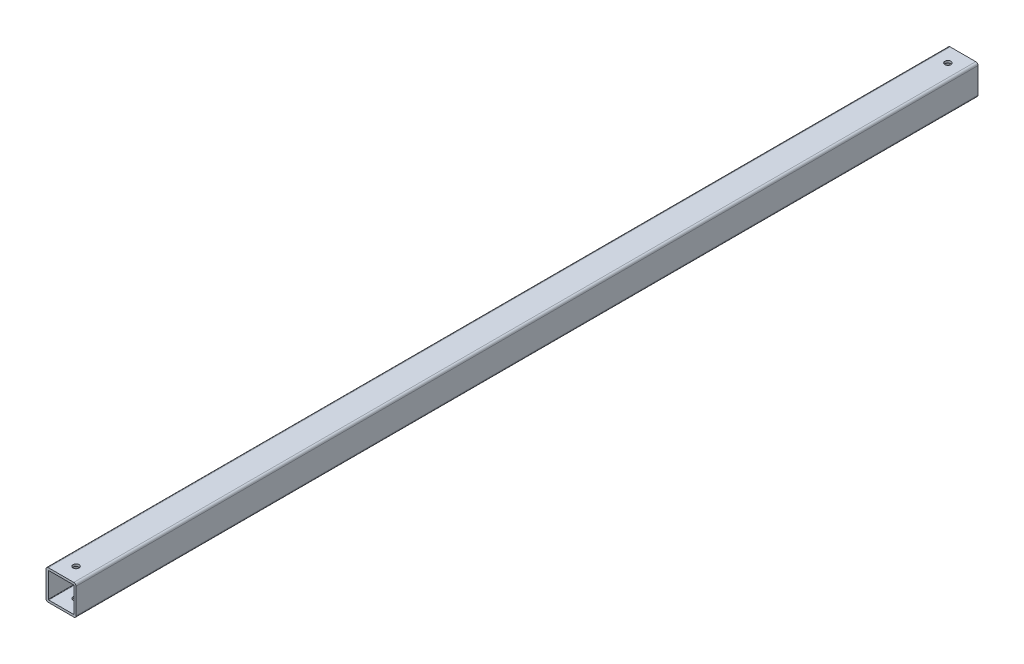
ISO-10303-21;
HEADER;
FILE_DESCRIPTION(('STEP AP214'),'2;1');
FILE_NAME('part.step','',(''),(''),'','','');
FILE_SCHEMA(('AUTOMOTIVE_DESIGN { 1 0 10303 214 1 1 1 1 }'));
ENDSEC;
DATA;
#1=APPLICATION_CONTEXT('core data for automotive mechanical design processes');
#2=APPLICATION_PROTOCOL_DEFINITION('international standard','automotive_design',2000,#1);
#3=PRODUCT_CONTEXT('',#1,'mechanical');
#4=PRODUCT('Part','Part','',(#3));
#5=PRODUCT_RELATED_PRODUCT_CATEGORY('part','',(#4));
#6=PRODUCT_DEFINITION_FORMATION('','',#4);
#7=PRODUCT_DEFINITION_CONTEXT('part definition',#1,'design');
#8=PRODUCT_DEFINITION('design','',#6,#7);
#9=PRODUCT_DEFINITION_SHAPE('','',#8);
#10=(LENGTH_UNIT() NAMED_UNIT(*) SI_UNIT(.MILLI.,.METRE.));
#11=(NAMED_UNIT(*) PLANE_ANGLE_UNIT() SI_UNIT($,.RADIAN.));
#12=(NAMED_UNIT(*) SI_UNIT($,.STERADIAN.) SOLID_ANGLE_UNIT());
#13=UNCERTAINTY_MEASURE_WITH_UNIT(LENGTH_MEASURE(1.E-05),#10,'distance_accuracy_value','');
#14=(GEOMETRIC_REPRESENTATION_CONTEXT(3) GLOBAL_UNCERTAINTY_ASSIGNED_CONTEXT((#13)) GLOBAL_UNIT_ASSIGNED_CONTEXT((#10,
#11,#12)) REPRESENTATION_CONTEXT('',''));
#15=CARTESIAN_POINT('',(0.,0.,0.));
#16=DIRECTION('',(0.,0.,1.));
#17=DIRECTION('',(1.,0.,0.));
#18=AXIS2_PLACEMENT_3D('',#15,#16,#17);
#19=CARTESIAN_POINT('',(0.,0.,1200.));
#20=DIRECTION('',(0.,0.,1.));
#21=DIRECTION('',(1.,0.,0.));
#22=AXIS2_PLACEMENT_3D('',#19,#20,#21);
#23=PLANE('',#22);
#24=DIRECTION('',(1.,0.,0.));
#25=VECTOR('',#24,1.);
#26=CARTESIAN_POINT('',(-20.,-20.,1200.));
#27=LINE('',#26,#25);
#28=CARTESIAN_POINT('',(-17.,-20.,1200.));
#29=VERTEX_POINT('',#28);
#30=CARTESIAN_POINT('',(17.,-20.,1200.));
#31=VERTEX_POINT('',#30);
#32=EDGE_CURVE('E211',#29,#31,#27,.T.);
#33=ORIENTED_EDGE('',*,*,#32,.T.);
#34=CARTESIAN_POINT('',(17.,-17.,1200.));
#35=DIRECTION('',(0.,0.,1.));
#36=DIRECTION('',(1.,0.,0.));
#37=AXIS2_PLACEMENT_3D('',#34,#35,#36);
#38=CIRCLE('',#37,3.);
#39=CARTESIAN_POINT('',(20.,-17.,1200.));
#40=VERTEX_POINT('',#39);
#41=EDGE_CURVE('E270',#31,#40,#38,.T.);
#42=ORIENTED_EDGE('',*,*,#41,.T.);
#43=DIRECTION('',(0.,1.,0.));
#44=VECTOR('',#43,1.);
#45=CARTESIAN_POINT('',(20.,20.,1200.));
#46=LINE('',#45,#44);
#47=CARTESIAN_POINT('',(20.,17.,1200.));
#48=VERTEX_POINT('',#47);
#49=EDGE_CURVE('E311',#40,#48,#46,.T.);
#50=ORIENTED_EDGE('',*,*,#49,.T.);
#51=CARTESIAN_POINT('',(17.,17.,1200.));
#52=DIRECTION('',(0.,0.,1.));
#53=DIRECTION('',(1.,0.,0.));
#54=AXIS2_PLACEMENT_3D('',#51,#52,#53);
#55=CIRCLE('',#54,3.);
#56=CARTESIAN_POINT('',(17.,20.,1200.));
#57=VERTEX_POINT('',#56);
#58=EDGE_CURVE('E266',#48,#57,#55,.T.);
#59=ORIENTED_EDGE('',*,*,#58,.T.);
#60=DIRECTION('',(-1.,0.,0.));
#61=VECTOR('',#60,1.);
#62=CARTESIAN_POINT('',(-20.,20.,1200.));
#63=LINE('',#62,#61);
#64=CARTESIAN_POINT('',(-17.,20.,1200.));
#65=VERTEX_POINT('',#64);
#66=EDGE_CURVE('E314',#57,#65,#63,.T.);
#67=ORIENTED_EDGE('',*,*,#66,.T.);
#68=CARTESIAN_POINT('',(-17.,17.,1200.));
#69=DIRECTION('',(0.,0.,1.));
#70=DIRECTION('',(1.,0.,0.));
#71=AXIS2_PLACEMENT_3D('',#68,#69,#70);
#72=CIRCLE('',#71,3.);
#73=CARTESIAN_POINT('',(-20.,17.,1200.));
#74=VERTEX_POINT('',#73);
#75=EDGE_CURVE('E92',#65,#74,#72,.T.);
#76=ORIENTED_EDGE('',*,*,#75,.T.);
#77=DIRECTION('',(0.,-1.,0.));
#78=VECTOR('',#77,1.);
#79=CARTESIAN_POINT('',(-20.,20.,1200.));
#80=LINE('',#79,#78);
#81=CARTESIAN_POINT('',(-20.,-17.,1200.));
#82=VERTEX_POINT('',#81);
#83=EDGE_CURVE('E216',#74,#82,#80,.T.);
#84=ORIENTED_EDGE('',*,*,#83,.T.);
#85=CARTESIAN_POINT('',(-17.,-17.,1200.));
#86=DIRECTION('',(0.,0.,1.));
#87=DIRECTION('',(1.,0.,0.));
#88=AXIS2_PLACEMENT_3D('',#85,#86,#87);
#89=CIRCLE('',#88,3.);
#90=EDGE_CURVE('E268',#82,#29,#89,.T.);
#91=ORIENTED_EDGE('',*,*,#90,.T.);
#92=EDGE_LOOP('',(#33,#42,#50,#59,#67,#76,#84,#91));
#93=FACE_BOUND('',#92,.T.);
#94=DIRECTION('',(-1.,0.,0.));
#95=VECTOR('',#94,1.);
#96=CARTESIAN_POINT('',(-20.,17.,1200.));
#97=LINE('',#96,#95);
#98=CARTESIAN_POINT('',(16.5,17.,1200.));
#99=VERTEX_POINT('',#98);
#100=CARTESIAN_POINT('',(-16.5,17.,1200.));
#101=VERTEX_POINT('',#100);
#102=EDGE_CURVE('E298',#99,#101,#97,.T.);
#103=ORIENTED_EDGE('',*,*,#102,.F.);
#104=CARTESIAN_POINT('',(16.5,16.5,1200.));
#105=DIRECTION('',(0.,0.,1.));
#106=DIRECTION('',(1.,0.,0.));
#107=AXIS2_PLACEMENT_3D('',#104,#105,#106);
#108=CIRCLE('',#107,0.5);
#109=CARTESIAN_POINT('',(17.,16.5,1200.));
#110=VERTEX_POINT('',#109);
#111=EDGE_CURVE('E241',#99,#110,#108,.F.);
#112=ORIENTED_EDGE('',*,*,#111,.T.);
#113=DIRECTION('',(0.,1.,0.));
#114=VECTOR('',#113,1.);
#115=CARTESIAN_POINT('',(17.,20.,1200.));
#116=LINE('',#115,#114);
#117=CARTESIAN_POINT('',(17.,-16.5,1200.));
#118=VERTEX_POINT('',#117);
#119=EDGE_CURVE('E295',#118,#110,#116,.T.);
#120=ORIENTED_EDGE('',*,*,#119,.F.);
#121=CARTESIAN_POINT('',(16.5,-16.5,1200.));
#122=DIRECTION('',(0.,0.,1.));
#123=DIRECTION('',(1.,0.,0.));
#124=AXIS2_PLACEMENT_3D('',#121,#122,#123);
#125=CIRCLE('',#124,0.5);
#126=CARTESIAN_POINT('',(16.5,-17.,1200.));
#127=VERTEX_POINT('',#126);
#128=EDGE_CURVE('E245',#118,#127,#125,.F.);
#129=ORIENTED_EDGE('',*,*,#128,.T.);
#130=DIRECTION('',(1.,0.,0.));
#131=VECTOR('',#130,1.);
#132=CARTESIAN_POINT('',(-20.,-17.,1200.));
#133=LINE('',#132,#131);
#134=CARTESIAN_POINT('',(-16.5,-17.,1200.));
#135=VERTEX_POINT('',#134);
#136=EDGE_CURVE('E303',#135,#127,#133,.T.);
#137=ORIENTED_EDGE('',*,*,#136,.F.);
#138=CARTESIAN_POINT('',(-16.5,-16.5,1200.));
#139=DIRECTION('',(0.,0.,1.));
#140=DIRECTION('',(1.,0.,0.));
#141=AXIS2_PLACEMENT_3D('',#138,#139,#140);
#142=CIRCLE('',#141,0.5);
#143=CARTESIAN_POINT('',(-17.,-16.5,1200.));
#144=VERTEX_POINT('',#143);
#145=EDGE_CURVE('E197',#135,#144,#142,.F.);
#146=ORIENTED_EDGE('',*,*,#145,.T.);
#147=DIRECTION('',(0.,-1.,0.));
#148=VECTOR('',#147,1.);
#149=CARTESIAN_POINT('',(-17.,20.,1200.));
#150=LINE('',#149,#148);
#151=CARTESIAN_POINT('',(-17.,16.5,1200.));
#152=VERTEX_POINT('',#151);
#153=EDGE_CURVE('E301',#152,#144,#150,.T.);
#154=ORIENTED_EDGE('',*,*,#153,.F.);
#155=CARTESIAN_POINT('',(-16.5,16.5,1200.));
#156=DIRECTION('',(0.,0.,1.));
#157=DIRECTION('',(1.,0.,0.));
#158=AXIS2_PLACEMENT_3D('',#155,#156,#157);
#159=CIRCLE('',#158,0.5);
#160=EDGE_CURVE('E196',#152,#101,#159,.F.);
#161=ORIENTED_EDGE('',*,*,#160,.T.);
#162=EDGE_LOOP('',(#103,#112,#120,#129,#137,#146,#154,#161));
#163=FACE_BOUND('',#162,.T.);
#164=ADVANCED_FACE('F68',(#93,#163),#23,.T.);
#165=CARTESIAN_POINT('',(0.,0.,0.));
#166=DIRECTION('',(0.,0.,1.));
#167=DIRECTION('',(1.,0.,0.));
#168=AXIS2_PLACEMENT_3D('',#165,#166,#167);
#169=PLANE('',#168);
#170=DIRECTION('',(0.,1.,0.));
#171=VECTOR('',#170,1.);
#172=CARTESIAN_POINT('',(20.,20.,0.));
#173=LINE('',#172,#171);
#174=CARTESIAN_POINT('',(20.,-17.,0.));
#175=VERTEX_POINT('',#174);
#176=CARTESIAN_POINT('',(20.,17.,0.));
#177=VERTEX_POINT('',#176);
#178=EDGE_CURVE('E306',#175,#177,#173,.T.);
#179=ORIENTED_EDGE('',*,*,#178,.F.);
#180=CARTESIAN_POINT('',(17.,-17.,0.));
#181=DIRECTION('',(0.,0.,1.));
#182=DIRECTION('',(1.,0.,0.));
#183=AXIS2_PLACEMENT_3D('',#180,#181,#182);
#184=CIRCLE('',#183,3.);
#185=CARTESIAN_POINT('',(17.,-20.,0.));
#186=VERTEX_POINT('',#185);
#187=EDGE_CURVE('E258',#175,#186,#184,.F.);
#188=ORIENTED_EDGE('',*,*,#187,.T.);
#189=DIRECTION('',(1.,0.,0.));
#190=VECTOR('',#189,1.);
#191=CARTESIAN_POINT('',(-20.,-20.,0.));
#192=LINE('',#191,#190);
#193=CARTESIAN_POINT('',(-17.,-20.,0.));
#194=VERTEX_POINT('',#193);
#195=EDGE_CURVE('E219',#194,#186,#192,.T.);
#196=ORIENTED_EDGE('',*,*,#195,.F.);
#197=CARTESIAN_POINT('',(-17.,-17.,0.));
#198=DIRECTION('',(0.,0.,1.));
#199=DIRECTION('',(1.,0.,0.));
#200=AXIS2_PLACEMENT_3D('',#197,#198,#199);
#201=CIRCLE('',#200,3.);
#202=CARTESIAN_POINT('',(-20.,-17.,0.));
#203=VERTEX_POINT('',#202);
#204=EDGE_CURVE('E256',#194,#203,#201,.F.);
#205=ORIENTED_EDGE('',*,*,#204,.T.);
#206=DIRECTION('',(0.,-1.,0.));
#207=VECTOR('',#206,1.);
#208=CARTESIAN_POINT('',(-20.,20.,0.));
#209=LINE('',#208,#207);
#210=CARTESIAN_POINT('',(-20.,17.,0.));
#211=VERTEX_POINT('',#210);
#212=EDGE_CURVE('E321',#211,#203,#209,.T.);
#213=ORIENTED_EDGE('',*,*,#212,.F.);
#214=CARTESIAN_POINT('',(-17.,17.,0.));
#215=DIRECTION('',(0.,0.,1.));
#216=DIRECTION('',(1.,0.,0.));
#217=AXIS2_PLACEMENT_3D('',#214,#215,#216);
#218=CIRCLE('',#217,3.);
#219=CARTESIAN_POINT('',(-17.,20.,0.));
#220=VERTEX_POINT('',#219);
#221=EDGE_CURVE('E252',#211,#220,#218,.F.);
#222=ORIENTED_EDGE('',*,*,#221,.T.);
#223=DIRECTION('',(-1.,0.,0.));
#224=VECTOR('',#223,1.);
#225=CARTESIAN_POINT('',(-20.,20.,0.));
#226=LINE('',#225,#224);
#227=CARTESIAN_POINT('',(17.,20.,0.));
#228=VERTEX_POINT('',#227);
#229=EDGE_CURVE('E319',#228,#220,#226,.T.);
#230=ORIENTED_EDGE('',*,*,#229,.F.);
#231=CARTESIAN_POINT('',(17.,17.,0.));
#232=DIRECTION('',(0.,0.,1.));
#233=DIRECTION('',(1.,0.,0.));
#234=AXIS2_PLACEMENT_3D('',#231,#232,#233);
#235=CIRCLE('',#234,3.);
#236=EDGE_CURVE('E254',#228,#177,#235,.F.);
#237=ORIENTED_EDGE('',*,*,#236,.T.);
#238=EDGE_LOOP('',(#179,#188,#196,#205,#213,#222,#230,#237));
#239=FACE_BOUND('',#238,.T.);
#240=DIRECTION('',(1.,0.,0.));
#241=VECTOR('',#240,1.);
#242=CARTESIAN_POINT('',(-20.,-17.,0.));
#243=LINE('',#242,#241);
#244=CARTESIAN_POINT('',(-16.5,-17.,0.));
#245=VERTEX_POINT('',#244);
#246=CARTESIAN_POINT('',(16.5,-17.,0.));
#247=VERTEX_POINT('',#246);
#248=EDGE_CURVE('E207',#245,#247,#243,.T.);
#249=ORIENTED_EDGE('',*,*,#248,.T.);
#250=CARTESIAN_POINT('',(16.5,-16.5,0.));
#251=DIRECTION('',(0.,0.,1.));
#252=DIRECTION('',(1.,0.,0.));
#253=AXIS2_PLACEMENT_3D('',#250,#251,#252);
#254=CIRCLE('',#253,0.5);
#255=CARTESIAN_POINT('',(17.,-16.5,0.));
#256=VERTEX_POINT('',#255);
#257=EDGE_CURVE('E243',#247,#256,#254,.T.);
#258=ORIENTED_EDGE('',*,*,#257,.T.);
#259=DIRECTION('',(0.,1.,0.));
#260=VECTOR('',#259,1.);
#261=CARTESIAN_POINT('',(17.,20.,0.));
#262=LINE('',#261,#260);
#263=CARTESIAN_POINT('',(17.,16.5,0.));
#264=VERTEX_POINT('',#263);
#265=EDGE_CURVE('E283',#256,#264,#262,.T.);
#266=ORIENTED_EDGE('',*,*,#265,.T.);
#267=CARTESIAN_POINT('',(16.5,16.5,0.));
#268=DIRECTION('',(0.,0.,1.));
#269=DIRECTION('',(1.,0.,0.));
#270=AXIS2_PLACEMENT_3D('',#267,#268,#269);
#271=CIRCLE('',#270,0.5);
#272=CARTESIAN_POINT('',(16.5,17.,0.));
#273=VERTEX_POINT('',#272);
#274=EDGE_CURVE('E239',#264,#273,#271,.T.);
#275=ORIENTED_EDGE('',*,*,#274,.T.);
#276=DIRECTION('',(-1.,0.,0.));
#277=VECTOR('',#276,1.);
#278=CARTESIAN_POINT('',(-20.,17.,0.));
#279=LINE('',#278,#277);
#280=CARTESIAN_POINT('',(-16.5,17.,0.));
#281=VERTEX_POINT('',#280);
#282=EDGE_CURVE('E191',#273,#281,#279,.T.);
#283=ORIENTED_EDGE('',*,*,#282,.T.);
#284=CARTESIAN_POINT('',(-16.5,16.5,0.));
#285=DIRECTION('',(0.,0.,1.));
#286=DIRECTION('',(1.,0.,0.));
#287=AXIS2_PLACEMENT_3D('',#284,#285,#286);
#288=CIRCLE('',#287,0.5);
#289=CARTESIAN_POINT('',(-17.,16.5,0.));
#290=VERTEX_POINT('',#289);
#291=EDGE_CURVE('E185',#281,#290,#288,.T.);
#292=ORIENTED_EDGE('',*,*,#291,.T.);
#293=DIRECTION('',(0.,-1.,0.));
#294=VECTOR('',#293,1.);
#295=CARTESIAN_POINT('',(-17.,20.,0.));
#296=LINE('',#295,#294);
#297=CARTESIAN_POINT('',(-17.,-16.5,0.));
#298=VERTEX_POINT('',#297);
#299=EDGE_CURVE('E189',#290,#298,#296,.T.);
#300=ORIENTED_EDGE('',*,*,#299,.T.);
#301=CARTESIAN_POINT('',(-16.5,-16.5,0.));
#302=DIRECTION('',(0.,0.,1.));
#303=DIRECTION('',(1.,0.,0.));
#304=AXIS2_PLACEMENT_3D('',#301,#302,#303);
#305=CIRCLE('',#304,0.5);
#306=EDGE_CURVE('E235',#298,#245,#305,.T.);
#307=ORIENTED_EDGE('',*,*,#306,.T.);
#308=EDGE_LOOP('',(#249,#258,#266,#275,#283,#292,#300,#307));
#309=FACE_BOUND('',#308,.T.);
#310=ADVANCED_FACE('F188',(#239,#309),#169,.F.);
#311=CARTESIAN_POINT('',(20.,20.,1200.));
#312=DIRECTION('',(-1.,0.,0.));
#313=DIRECTION('',(0.,-1.,0.));
#314=AXIS2_PLACEMENT_3D('',#311,#312,#313);
#315=PLANE('',#314);
#316=ORIENTED_EDGE('',*,*,#49,.F.);
#317=DIRECTION('',(0.,0.,-1.));
#318=VECTOR('',#317,1.);
#319=CARTESIAN_POINT('',(20.,-17.,1200.));
#320=LINE('',#319,#318);
#321=EDGE_CURVE('E249',#40,#175,#320,.T.);
#322=ORIENTED_EDGE('',*,*,#321,.T.);
#323=ORIENTED_EDGE('',*,*,#178,.T.);
#324=DIRECTION('',(0.,0.,-1.));
#325=VECTOR('',#324,1.);
#326=CARTESIAN_POINT('',(20.,17.,1200.));
#327=LINE('',#326,#325);
#328=EDGE_CURVE('E247',#177,#48,#327,.F.);
#329=ORIENTED_EDGE('',*,*,#328,.T.);
#330=EDGE_LOOP('',(#316,#322,#323,#329));
#331=FACE_BOUND('',#330,.T.);
#332=ADVANCED_FACE('F339',(#331),#315,.F.);
#333=CARTESIAN_POINT('',(-20.,20.,1200.));
#334=DIRECTION('',(0.,-1.,0.));
#335=DIRECTION('',(0.,0.,-1.));
#336=AXIS2_PLACEMENT_3D('',#333,#334,#335);
#337=PLANE('',#336);
#338=CARTESIAN_POINT('',(0.,20.,20.));
#339=DIRECTION('',(0.,1.,0.));
#340=DIRECTION('',(0.,0.,1.));
#341=AXIS2_PLACEMENT_3D('',#338,#339,#340);
#342=CIRCLE('',#341,4.);
#343=CARTESIAN_POINT('',(0.,20.,24.));
#344=VERTEX_POINT('',#343);
#345=EDGE_CURVE('E449',#344,#344,#342,.T.);
#346=ORIENTED_EDGE('',*,*,#345,.F.);
#347=EDGE_LOOP('',(#346));
#348=FACE_BOUND('',#347,.T.);
#349=CARTESIAN_POINT('',(1.44508322299388E-13,20.,1180.));
#350=DIRECTION('',(0.,1.,0.));
#351=DIRECTION('',(0.,0.,1.));
#352=AXIS2_PLACEMENT_3D('',#349,#350,#351);
#353=CIRCLE('',#352,4.);
#354=CARTESIAN_POINT('',(1.44508322299388E-13,20.,1184.));
#355=VERTEX_POINT('',#354);
#356=EDGE_CURVE('E286',#355,#355,#353,.T.);
#357=ORIENTED_EDGE('',*,*,#356,.F.);
#358=EDGE_LOOP('',(#357));
#359=FACE_BOUND('',#358,.T.);
#360=ORIENTED_EDGE('',*,*,#66,.F.);
#361=DIRECTION('',(0.,0.,-1.));
#362=VECTOR('',#361,1.);
#363=CARTESIAN_POINT('',(17.,20.,1200.));
#364=LINE('',#363,#362);
#365=EDGE_CURVE('E14',#57,#228,#364,.T.);
#366=ORIENTED_EDGE('',*,*,#365,.T.);
#367=ORIENTED_EDGE('',*,*,#229,.T.);
#368=DIRECTION('',(0.,0.,-1.));
#369=VECTOR('',#368,1.);
#370=CARTESIAN_POINT('',(-17.,20.,1200.));
#371=LINE('',#370,#369);
#372=EDGE_CURVE('E77',#220,#65,#371,.F.);
#373=ORIENTED_EDGE('',*,*,#372,.T.);
#374=EDGE_LOOP('',(#360,#366,#367,#373));
#375=FACE_BOUND('',#374,.T.);
#376=ADVANCED_FACE('F347',(#348,#359,#375),#337,.F.);
#377=CARTESIAN_POINT('',(-20.,20.,1200.));
#378=DIRECTION('',(1.,0.,0.));
#379=DIRECTION('',(0.,1.,0.));
#380=AXIS2_PLACEMENT_3D('',#377,#378,#379);
#381=PLANE('',#380);
#382=ORIENTED_EDGE('',*,*,#212,.T.);
#383=DIRECTION('',(0.,0.,-1.));
#384=VECTOR('',#383,1.);
#385=CARTESIAN_POINT('',(-20.,-17.,1200.));
#386=LINE('',#385,#384);
#387=EDGE_CURVE('E85',#203,#82,#386,.F.);
#388=ORIENTED_EDGE('',*,*,#387,.T.);
#389=ORIENTED_EDGE('',*,*,#83,.F.);
#390=DIRECTION('',(0.,0.,-1.));
#391=VECTOR('',#390,1.);
#392=CARTESIAN_POINT('',(-20.,17.,1200.));
#393=LINE('',#392,#391);
#394=EDGE_CURVE('E272',#74,#211,#393,.T.);
#395=ORIENTED_EDGE('',*,*,#394,.T.);
#396=EDGE_LOOP('',(#382,#388,#389,#395));
#397=FACE_BOUND('',#396,.T.);
#398=ADVANCED_FACE('F352',(#397),#381,.F.);
#399=CARTESIAN_POINT('',(-20.,-20.,1200.));
#400=DIRECTION('',(0.,1.,0.));
#401=DIRECTION('',(0.,0.,1.));
#402=AXIS2_PLACEMENT_3D('',#399,#400,#401);
#403=PLANE('',#402);
#404=CARTESIAN_POINT('',(0.,-20.,20.));
#405=DIRECTION('',(0.,1.,0.));
#406=DIRECTION('',(0.,0.,1.));
#407=AXIS2_PLACEMENT_3D('',#404,#405,#406);
#408=CIRCLE('',#407,3.99999999999999);
#409=CARTESIAN_POINT('',(0.,-20.,24.));
#410=VERTEX_POINT('',#409);
#411=EDGE_CURVE('E450',#410,#410,#408,.T.);
#412=ORIENTED_EDGE('',*,*,#411,.T.);
#413=EDGE_LOOP('',(#412));
#414=FACE_BOUND('',#413,.T.);
#415=CARTESIAN_POINT('',(1.44508322299388E-13,-20.,1180.));
#416=DIRECTION('',(0.,1.,0.));
#417=DIRECTION('',(0.,0.,1.));
#418=AXIS2_PLACEMENT_3D('',#415,#416,#417);
#419=CIRCLE('',#418,3.99999999999999);
#420=CARTESIAN_POINT('',(1.44508322299388E-13,-20.,1184.));
#421=VERTEX_POINT('',#420);
#422=EDGE_CURVE('E279',#421,#421,#419,.T.);
#423=ORIENTED_EDGE('',*,*,#422,.T.);
#424=EDGE_LOOP('',(#423));
#425=FACE_BOUND('',#424,.T.);
#426=ORIENTED_EDGE('',*,*,#195,.T.);
#427=DIRECTION('',(0.,0.,-1.));
#428=VECTOR('',#427,1.);
#429=CARTESIAN_POINT('',(17.,-20.,1200.));
#430=LINE('',#429,#428);
#431=EDGE_CURVE('E263',#186,#31,#430,.F.);
#432=ORIENTED_EDGE('',*,*,#431,.T.);
#433=ORIENTED_EDGE('',*,*,#32,.F.);
#434=DIRECTION('',(0.,0.,-1.));
#435=VECTOR('',#434,1.);
#436=CARTESIAN_POINT('',(-17.,-20.,1200.));
#437=LINE('',#436,#435);
#438=EDGE_CURVE('E260',#29,#194,#437,.T.);
#439=ORIENTED_EDGE('',*,*,#438,.T.);
#440=EDGE_LOOP('',(#426,#432,#433,#439));
#441=FACE_BOUND('',#440,.T.);
#442=ADVANCED_FACE('F327',(#414,#425,#441),#403,.F.);
#443=CARTESIAN_POINT('',(17.,20.,1200.));
#444=DIRECTION('',(-1.,0.,0.));
#445=DIRECTION('',(0.,-1.,0.));
#446=AXIS2_PLACEMENT_3D('',#443,#444,#445);
#447=PLANE('',#446);
#448=ORIENTED_EDGE('',*,*,#119,.T.);
#449=DIRECTION('',(0.,0.,-1.));
#450=VECTOR('',#449,1.);
#451=CARTESIAN_POINT('',(17.,16.5,0.));
#452=LINE('',#451,#450);
#453=EDGE_CURVE('E232',#110,#264,#452,.T.);
#454=ORIENTED_EDGE('',*,*,#453,.T.);
#455=ORIENTED_EDGE('',*,*,#265,.F.);
#456=DIRECTION('',(0.,0.,-1.));
#457=VECTOR('',#456,1.);
#458=CARTESIAN_POINT('',(17.,-16.5,1200.));
#459=LINE('',#458,#457);
#460=EDGE_CURVE('E230',#256,#118,#459,.F.);
#461=ORIENTED_EDGE('',*,*,#460,.T.);
#462=EDGE_LOOP('',(#448,#454,#455,#461));
#463=FACE_BOUND('',#462,.T.);
#464=ADVANCED_FACE('F371',(#463),#447,.T.);
#465=CARTESIAN_POINT('',(-20.,17.,1200.));
#466=DIRECTION('',(0.,-1.,0.));
#467=DIRECTION('',(0.,0.,-1.));
#468=AXIS2_PLACEMENT_3D('',#465,#466,#467);
#469=PLANE('',#468);
#470=CARTESIAN_POINT('',(0.,17.,20.));
#471=DIRECTION('',(0.,-1.,0.));
#472=DIRECTION('',(0.,0.,-1.));
#473=AXIS2_PLACEMENT_3D('',#470,#471,#472);
#474=CIRCLE('',#473,4.);
#475=CARTESIAN_POINT('',(0.,17.,16.));
#476=VERTEX_POINT('',#475);
#477=EDGE_CURVE('E72',#476,#476,#474,.T.);
#478=ORIENTED_EDGE('',*,*,#477,.F.);
#479=EDGE_LOOP('',(#478));
#480=FACE_BOUND('',#479,.T.);
#481=CARTESIAN_POINT('',(1.44508322299388E-13,17.,1180.));
#482=DIRECTION('',(0.,-1.,0.));
#483=DIRECTION('',(0.,0.,-1.));
#484=AXIS2_PLACEMENT_3D('',#481,#482,#483);
#485=CIRCLE('',#484,4.);
#486=CARTESIAN_POINT('',(1.44508322299388E-13,17.,1176.));
#487=VERTEX_POINT('',#486);
#488=EDGE_CURVE('E278',#487,#487,#485,.T.);
#489=ORIENTED_EDGE('',*,*,#488,.F.);
#490=EDGE_LOOP('',(#489));
#491=FACE_BOUND('',#490,.T.);
#492=ORIENTED_EDGE('',*,*,#102,.T.);
#493=DIRECTION('',(0.,0.,-1.));
#494=VECTOR('',#493,1.);
#495=CARTESIAN_POINT('',(-16.5,17.,0.));
#496=LINE('',#495,#494);
#497=EDGE_CURVE('E228',#101,#281,#496,.T.);
#498=ORIENTED_EDGE('',*,*,#497,.T.);
#499=ORIENTED_EDGE('',*,*,#282,.F.);
#500=DIRECTION('',(0.,0.,-1.));
#501=VECTOR('',#500,1.);
#502=CARTESIAN_POINT('',(16.5,17.,1200.));
#503=LINE('',#502,#501);
#504=EDGE_CURVE('E226',#273,#99,#503,.F.);
#505=ORIENTED_EDGE('',*,*,#504,.T.);
#506=EDGE_LOOP('',(#492,#498,#499,#505));
#507=FACE_BOUND('',#506,.T.);
#508=ADVANCED_FACE('F411',(#480,#491,#507),#469,.T.);
#509=CARTESIAN_POINT('',(-17.,20.,1200.));
#510=DIRECTION('',(1.,0.,0.));
#511=DIRECTION('',(0.,1.,0.));
#512=AXIS2_PLACEMENT_3D('',#509,#510,#511);
#513=PLANE('',#512);
#514=ORIENTED_EDGE('',*,*,#153,.T.);
#515=DIRECTION('',(0.,0.,-1.));
#516=VECTOR('',#515,1.);
#517=CARTESIAN_POINT('',(-17.,-16.5,0.));
#518=LINE('',#517,#516);
#519=EDGE_CURVE('E206',#144,#298,#518,.T.);
#520=ORIENTED_EDGE('',*,*,#519,.T.);
#521=ORIENTED_EDGE('',*,*,#299,.F.);
#522=DIRECTION('',(0.,0.,-1.));
#523=VECTOR('',#522,1.);
#524=CARTESIAN_POINT('',(-17.,16.5,1200.));
#525=LINE('',#524,#523);
#526=EDGE_CURVE('E203',#290,#152,#525,.F.);
#527=ORIENTED_EDGE('',*,*,#526,.T.);
#528=EDGE_LOOP('',(#514,#520,#521,#527));
#529=FACE_BOUND('',#528,.T.);
#530=ADVANCED_FACE('F202',(#529),#513,.T.);
#531=CARTESIAN_POINT('',(-20.,-17.,1200.));
#532=DIRECTION('',(0.,1.,0.));
#533=DIRECTION('',(0.,0.,1.));
#534=AXIS2_PLACEMENT_3D('',#531,#532,#533);
#535=PLANE('',#534);
#536=CARTESIAN_POINT('',(0.,-17.,20.));
#537=DIRECTION('',(0.,1.,0.));
#538=DIRECTION('',(0.,0.,1.));
#539=AXIS2_PLACEMENT_3D('',#536,#537,#538);
#540=CIRCLE('',#539,4.);
#541=CARTESIAN_POINT('',(0.,-17.,24.));
#542=VERTEX_POINT('',#541);
#543=EDGE_CURVE('E291',#542,#542,#540,.T.);
#544=ORIENTED_EDGE('',*,*,#543,.F.);
#545=EDGE_LOOP('',(#544));
#546=FACE_BOUND('',#545,.T.);
#547=CARTESIAN_POINT('',(1.44508322299388E-13,-17.,1180.));
#548=DIRECTION('',(0.,1.,0.));
#549=DIRECTION('',(0.,0.,1.));
#550=AXIS2_PLACEMENT_3D('',#547,#548,#549);
#551=CIRCLE('',#550,4.);
#552=CARTESIAN_POINT('',(1.44508322299388E-13,-17.,1184.));
#553=VERTEX_POINT('',#552);
#554=EDGE_CURVE('E276',#553,#553,#551,.T.);
#555=ORIENTED_EDGE('',*,*,#554,.F.);
#556=EDGE_LOOP('',(#555));
#557=FACE_BOUND('',#556,.T.);
#558=ORIENTED_EDGE('',*,*,#248,.F.);
#559=DIRECTION('',(0.,0.,-1.));
#560=VECTOR('',#559,1.);
#561=CARTESIAN_POINT('',(-16.5,-17.,1200.));
#562=LINE('',#561,#560);
#563=EDGE_CURVE('E224',#245,#135,#562,.F.);
#564=ORIENTED_EDGE('',*,*,#563,.T.);
#565=ORIENTED_EDGE('',*,*,#136,.T.);
#566=DIRECTION('',(0.,0.,-1.));
#567=VECTOR('',#566,1.);
#568=CARTESIAN_POINT('',(16.5,-17.,0.));
#569=LINE('',#568,#567);
#570=EDGE_CURVE('E213',#127,#247,#569,.T.);
#571=ORIENTED_EDGE('',*,*,#570,.T.);
#572=EDGE_LOOP('',(#558,#564,#565,#571));
#573=FACE_BOUND('',#572,.T.);
#574=ADVANCED_FACE('F387',(#546,#557,#573),#535,.T.);
#575=CARTESIAN_POINT('',(-16.5,-16.5,1200.));
#576=DIRECTION('',(0.,0.,1.));
#577=DIRECTION('',(1.,0.,0.));
#578=AXIS2_PLACEMENT_3D('',#575,#576,#577);
#579=CYLINDRICAL_SURFACE('',#578,0.5);
#580=ORIENTED_EDGE('',*,*,#145,.F.);
#581=ORIENTED_EDGE('',*,*,#563,.F.);
#582=ORIENTED_EDGE('',*,*,#306,.F.);
#583=ORIENTED_EDGE('',*,*,#519,.F.);
#584=EDGE_LOOP('',(#580,#581,#582,#583));
#585=FACE_BOUND('',#584,.T.);
#586=ADVANCED_FACE('F384',(#585),#579,.F.);
#587=CARTESIAN_POINT('',(-16.5,16.5,1200.));
#588=DIRECTION('',(0.,0.,1.));
#589=DIRECTION('',(1.,0.,0.));
#590=AXIS2_PLACEMENT_3D('',#587,#588,#589);
#591=CYLINDRICAL_SURFACE('',#590,0.5);
#592=ORIENTED_EDGE('',*,*,#160,.F.);
#593=ORIENTED_EDGE('',*,*,#526,.F.);
#594=ORIENTED_EDGE('',*,*,#291,.F.);
#595=ORIENTED_EDGE('',*,*,#497,.F.);
#596=EDGE_LOOP('',(#592,#593,#594,#595));
#597=FACE_BOUND('',#596,.T.);
#598=ADVANCED_FACE('F210',(#597),#591,.F.);
#599=CARTESIAN_POINT('',(16.5,16.5,1200.));
#600=DIRECTION('',(0.,0.,1.));
#601=DIRECTION('',(1.,0.,0.));
#602=AXIS2_PLACEMENT_3D('',#599,#600,#601);
#603=CYLINDRICAL_SURFACE('',#602,0.5);
#604=ORIENTED_EDGE('',*,*,#111,.F.);
#605=ORIENTED_EDGE('',*,*,#504,.F.);
#606=ORIENTED_EDGE('',*,*,#274,.F.);
#607=ORIENTED_EDGE('',*,*,#453,.F.);
#608=EDGE_LOOP('',(#604,#605,#606,#607));
#609=FACE_BOUND('',#608,.T.);
#610=ADVANCED_FACE('F391',(#609),#603,.F.);
#611=CARTESIAN_POINT('',(16.5,-16.5,1200.));
#612=DIRECTION('',(0.,0.,1.));
#613=DIRECTION('',(1.,0.,0.));
#614=AXIS2_PLACEMENT_3D('',#611,#612,#613);
#615=CYLINDRICAL_SURFACE('',#614,0.5);
#616=ORIENTED_EDGE('',*,*,#128,.F.);
#617=ORIENTED_EDGE('',*,*,#460,.F.);
#618=ORIENTED_EDGE('',*,*,#257,.F.);
#619=ORIENTED_EDGE('',*,*,#570,.F.);
#620=EDGE_LOOP('',(#616,#617,#618,#619));
#621=FACE_BOUND('',#620,.T.);
#622=ADVANCED_FACE('F362',(#621),#615,.F.);
#623=CARTESIAN_POINT('',(17.,-17.,1200.));
#624=DIRECTION('',(0.,0.,-1.));
#625=DIRECTION('',(-1.,0.,0.));
#626=AXIS2_PLACEMENT_3D('',#623,#624,#625);
#627=CYLINDRICAL_SURFACE('',#626,3.);
#628=ORIENTED_EDGE('',*,*,#41,.F.);
#629=ORIENTED_EDGE('',*,*,#431,.F.);
#630=ORIENTED_EDGE('',*,*,#187,.F.);
#631=ORIENTED_EDGE('',*,*,#321,.F.);
#632=EDGE_LOOP('',(#628,#629,#630,#631));
#633=FACE_BOUND('',#632,.T.);
#634=ADVANCED_FACE('F333',(#633),#627,.T.);
#635=CARTESIAN_POINT('',(-17.,-17.,1200.));
#636=DIRECTION('',(0.,0.,-1.));
#637=DIRECTION('',(-1.,0.,0.));
#638=AXIS2_PLACEMENT_3D('',#635,#636,#637);
#639=CYLINDRICAL_SURFACE('',#638,3.);
#640=ORIENTED_EDGE('',*,*,#90,.F.);
#641=ORIENTED_EDGE('',*,*,#387,.F.);
#642=ORIENTED_EDGE('',*,*,#204,.F.);
#643=ORIENTED_EDGE('',*,*,#438,.F.);
#644=EDGE_LOOP('',(#640,#641,#642,#643));
#645=FACE_BOUND('',#644,.T.);
#646=ADVANCED_FACE('F355',(#645),#639,.T.);
#647=CARTESIAN_POINT('',(17.,17.,1200.));
#648=DIRECTION('',(0.,0.,-1.));
#649=DIRECTION('',(-1.,0.,0.));
#650=AXIS2_PLACEMENT_3D('',#647,#648,#649);
#651=CYLINDRICAL_SURFACE('',#650,3.);
#652=ORIENTED_EDGE('',*,*,#58,.F.);
#653=ORIENTED_EDGE('',*,*,#328,.F.);
#654=ORIENTED_EDGE('',*,*,#236,.F.);
#655=ORIENTED_EDGE('',*,*,#365,.F.);
#656=EDGE_LOOP('',(#652,#653,#654,#655));
#657=FACE_BOUND('',#656,.T.);
#658=ADVANCED_FACE('F343',(#657),#651,.T.);
#659=CARTESIAN_POINT('',(-17.,17.,1200.));
#660=DIRECTION('',(0.,0.,-1.));
#661=DIRECTION('',(-1.,0.,0.));
#662=AXIS2_PLACEMENT_3D('',#659,#660,#661);
#663=CYLINDRICAL_SURFACE('',#662,3.);
#664=ORIENTED_EDGE('',*,*,#75,.F.);
#665=ORIENTED_EDGE('',*,*,#372,.F.);
#666=ORIENTED_EDGE('',*,*,#221,.F.);
#667=ORIENTED_EDGE('',*,*,#394,.F.);
#668=EDGE_LOOP('',(#664,#665,#666,#667));
#669=FACE_BOUND('',#668,.T.);
#670=ADVANCED_FACE('F70',(#669),#663,.T.);
#671=CARTESIAN_POINT('',(1.44508322299388E-13,20.,1180.));
#672=DIRECTION('',(0.,1.,0.));
#673=DIRECTION('',(0.,0.,1.));
#674=AXIS2_PLACEMENT_3D('',#671,#672,#673);
#675=CYLINDRICAL_SURFACE('',#674,4.);
#676=ORIENTED_EDGE('',*,*,#554,.T.);
#677=EDGE_LOOP('',(#676));
#678=FACE_BOUND('',#677,.T.);
#679=ORIENTED_EDGE('',*,*,#422,.F.);
#680=EDGE_LOOP('',(#679));
#681=FACE_BOUND('',#680,.T.);
#682=ADVANCED_FACE('F431',(#678,#681),#675,.F.);
#683=ORIENTED_EDGE('',*,*,#488,.T.);
#684=EDGE_LOOP('',(#683));
#685=FACE_BOUND('',#684,.T.);
#686=ORIENTED_EDGE('',*,*,#356,.T.);
#687=EDGE_LOOP('',(#686));
#688=FACE_BOUND('',#687,.T.);
#689=ADVANCED_FACE('F434',(#685,#688),#675,.F.);
#690=CARTESIAN_POINT('',(0.,20.,20.));
#691=DIRECTION('',(0.,1.,0.));
#692=DIRECTION('',(0.,0.,1.));
#693=AXIS2_PLACEMENT_3D('',#690,#691,#692);
#694=CYLINDRICAL_SURFACE('',#693,4.);
#695=ORIENTED_EDGE('',*,*,#477,.T.);
#696=EDGE_LOOP('',(#695));
#697=FACE_BOUND('',#696,.T.);
#698=ORIENTED_EDGE('',*,*,#345,.T.);
#699=EDGE_LOOP('',(#698));
#700=FACE_BOUND('',#699,.T.);
#701=ADVANCED_FACE('F435',(#697,#700),#694,.F.);
#702=ORIENTED_EDGE('',*,*,#543,.T.);
#703=EDGE_LOOP('',(#702));
#704=FACE_BOUND('',#703,.T.);
#705=ORIENTED_EDGE('',*,*,#411,.F.);
#706=EDGE_LOOP('',(#705));
#707=FACE_BOUND('',#706,.T.);
#708=ADVANCED_FACE('F437',(#704,#707),#694,.F.);
#709=CLOSED_SHELL('',(#164,#310,#332,#376,#398,#442,#464,#508,#530,#574,#586,#598,#610,#622,
#634,#646,#658,#670,#682,#689,#701,#708));
#710=MANIFOLD_SOLID_BREP('B2',#709);
#711=ADVANCED_BREP_SHAPE_REPRESENTATION('',(#18,#710),#14);
#712=SHAPE_DEFINITION_REPRESENTATION(#9,#711);
ENDSEC;
END-ISO-10303-21;
